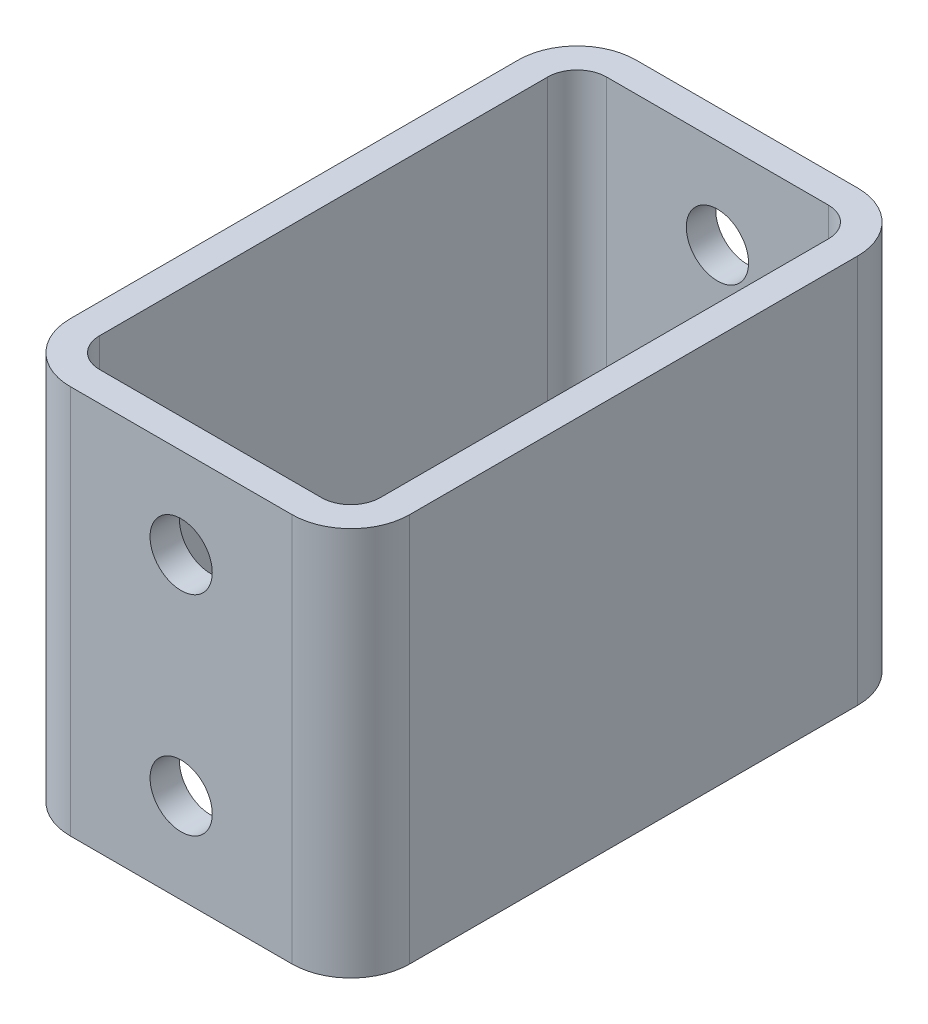
ISO-10303-21;
HEADER;
FILE_DESCRIPTION(('STEP AP214'),'2;1');
FILE_NAME('part.step','',(''),(''),'','','');
FILE_SCHEMA(('AUTOMOTIVE_DESIGN { 1 0 10303 214 1 1 1 1 }'));
ENDSEC;
DATA;
#1=APPLICATION_CONTEXT('core data for automotive mechanical design processes');
#2=APPLICATION_PROTOCOL_DEFINITION('international standard','automotive_design',2000,#1);
#3=PRODUCT_CONTEXT('',#1,'mechanical');
#4=PRODUCT('Part','Part','',(#3));
#5=PRODUCT_RELATED_PRODUCT_CATEGORY('part','',(#4));
#6=PRODUCT_DEFINITION_FORMATION('','',#4);
#7=PRODUCT_DEFINITION_CONTEXT('part definition',#1,'design');
#8=PRODUCT_DEFINITION('design','',#6,#7);
#9=PRODUCT_DEFINITION_SHAPE('','',#8);
#10=(LENGTH_UNIT() NAMED_UNIT(*) SI_UNIT(.MILLI.,.METRE.));
#11=(NAMED_UNIT(*) PLANE_ANGLE_UNIT() SI_UNIT($,.RADIAN.));
#12=(NAMED_UNIT(*) SI_UNIT($,.STERADIAN.) SOLID_ANGLE_UNIT());
#13=UNCERTAINTY_MEASURE_WITH_UNIT(LENGTH_MEASURE(1.E-05),#10,'distance_accuracy_value','');
#14=(GEOMETRIC_REPRESENTATION_CONTEXT(3) GLOBAL_UNCERTAINTY_ASSIGNED_CONTEXT((#13)) GLOBAL_UNIT_ASSIGNED_CONTEXT((#10,
#11,#12)) REPRESENTATION_CONTEXT('',''));
#15=CARTESIAN_POINT('',(0.,0.,0.));
#16=DIRECTION('',(0.,0.,1.));
#17=DIRECTION('',(1.,0.,0.));
#18=AXIS2_PLACEMENT_3D('',#15,#16,#17);
#19=CARTESIAN_POINT('',(9.8,34.4,-19.8));
#20=DIRECTION('',(0.,-1.,0.));
#21=DIRECTION('',(0.,0.,-1.));
#22=AXIS2_PLACEMENT_3D('',#19,#20,#21);
#23=CYLINDRICAL_SURFACE('',#22,5.2);
#24=CARTESIAN_POINT('',(9.8,0.,-19.8));
#25=DIRECTION('',(0.,1.,0.));
#26=DIRECTION('',(0.,0.,1.));
#27=AXIS2_PLACEMENT_3D('',#24,#25,#26);
#28=CIRCLE('',#27,5.2);
#29=CARTESIAN_POINT('',(15.,0.,-19.8));
#30=VERTEX_POINT('',#29);
#31=CARTESIAN_POINT('',(9.8,0.,-25.));
#32=VERTEX_POINT('',#31);
#33=EDGE_CURVE('E242',#30,#32,#28,.T.);
#34=ORIENTED_EDGE('',*,*,#33,.T.);
#35=DIRECTION('',(0.,-1.,0.));
#36=VECTOR('',#35,1.);
#37=CARTESIAN_POINT('',(9.8,34.4,-25.));
#38=LINE('',#37,#36);
#39=CARTESIAN_POINT('',(9.8,34.4,-25.));
#40=VERTEX_POINT('',#39);
#41=EDGE_CURVE('E12',#40,#32,#38,.T.);
#42=ORIENTED_EDGE('',*,*,#41,.F.);
#43=CARTESIAN_POINT('',(9.8,34.4,-19.8));
#44=DIRECTION('',(0.,1.,0.));
#45=DIRECTION('',(0.,0.,1.));
#46=AXIS2_PLACEMENT_3D('',#43,#44,#45);
#47=CIRCLE('',#46,5.2);
#48=CARTESIAN_POINT('',(15.,34.4,-19.8));
#49=VERTEX_POINT('',#48);
#50=EDGE_CURVE('E321',#49,#40,#47,.T.);
#51=ORIENTED_EDGE('',*,*,#50,.F.);
#52=DIRECTION('',(0.,-1.,0.));
#53=VECTOR('',#52,1.);
#54=CARTESIAN_POINT('',(15.,34.4,-19.8));
#55=LINE('',#54,#53);
#56=EDGE_CURVE('E257',#49,#30,#55,.T.);
#57=ORIENTED_EDGE('',*,*,#56,.T.);
#58=EDGE_LOOP('',(#34,#42,#51,#57));
#59=FACE_BOUND('',#58,.T.);
#60=ADVANCED_FACE('F68',(#59),#23,.T.);
#61=CARTESIAN_POINT('',(9.8,34.4,-25.));
#62=DIRECTION('',(0.,0.,1.));
#63=DIRECTION('',(1.,0.,0.));
#64=AXIS2_PLACEMENT_3D('',#61,#62,#63);
#65=PLANE('',#64);
#66=CARTESIAN_POINT('',(0.,26.435,-25.));
#67=DIRECTION('',(0.,0.,1.));
#68=DIRECTION('',(1.,0.,0.));
#69=AXIS2_PLACEMENT_3D('',#66,#67,#68);
#70=CIRCLE('',#69,2.74999999999999);
#71=CARTESIAN_POINT('',(2.74999999999999,26.435,-25.));
#72=VERTEX_POINT('',#71);
#73=EDGE_CURVE('E441',#72,#72,#70,.T.);
#74=ORIENTED_EDGE('',*,*,#73,.T.);
#75=EDGE_LOOP('',(#74));
#76=FACE_BOUND('',#75,.T.);
#77=CARTESIAN_POINT('',(0.,7.965,-25.));
#78=DIRECTION('',(0.,0.,1.));
#79=DIRECTION('',(1.,0.,0.));
#80=AXIS2_PLACEMENT_3D('',#77,#78,#79);
#81=CIRCLE('',#80,2.74999999999999);
#82=CARTESIAN_POINT('',(2.75,7.965,-25.));
#83=VERTEX_POINT('',#82);
#84=EDGE_CURVE('E284',#83,#83,#81,.T.);
#85=ORIENTED_EDGE('',*,*,#84,.T.);
#86=EDGE_LOOP('',(#85));
#87=FACE_BOUND('',#86,.T.);
#88=DIRECTION('',(-1.,0.,0.));
#89=VECTOR('',#88,1.);
#90=CARTESIAN_POINT('',(9.8,0.,-25.));
#91=LINE('',#90,#89);
#92=CARTESIAN_POINT('',(-9.8,0.,-25.));
#93=VERTEX_POINT('',#92);
#94=EDGE_CURVE('E245',#32,#93,#91,.T.);
#95=ORIENTED_EDGE('',*,*,#94,.T.);
#96=DIRECTION('',(0.,-1.,0.));
#97=VECTOR('',#96,1.);
#98=CARTESIAN_POINT('',(-9.8,34.4,-25.));
#99=LINE('',#98,#97);
#100=CARTESIAN_POINT('',(-9.8,34.4,-25.));
#101=VERTEX_POINT('',#100);
#102=EDGE_CURVE('E78',#101,#93,#99,.T.);
#103=ORIENTED_EDGE('',*,*,#102,.F.);
#104=DIRECTION('',(-1.,0.,0.));
#105=VECTOR('',#104,1.);
#106=CARTESIAN_POINT('',(9.8,34.4,-25.));
#107=LINE('',#106,#105);
#108=EDGE_CURVE('E323',#40,#101,#107,.T.);
#109=ORIENTED_EDGE('',*,*,#108,.F.);
#110=ORIENTED_EDGE('',*,*,#41,.T.);
#111=EDGE_LOOP('',(#95,#103,#109,#110));
#112=FACE_BOUND('',#111,.T.);
#113=ADVANCED_FACE('F361',(#76,#87,#112),#65,.F.);
#114=CARTESIAN_POINT('',(-9.8,34.4,-19.8));
#115=DIRECTION('',(0.,-1.,0.));
#116=DIRECTION('',(0.,0.,-1.));
#117=AXIS2_PLACEMENT_3D('',#114,#115,#116);
#118=CYLINDRICAL_SURFACE('',#117,5.2);
#119=CARTESIAN_POINT('',(-9.8,0.,-19.8));
#120=DIRECTION('',(0.,1.,0.));
#121=DIRECTION('',(0.,0.,1.));
#122=AXIS2_PLACEMENT_3D('',#119,#120,#121);
#123=CIRCLE('',#122,5.2);
#124=CARTESIAN_POINT('',(-15.,0.,-19.8));
#125=VERTEX_POINT('',#124);
#126=EDGE_CURVE('E247',#93,#125,#123,.T.);
#127=ORIENTED_EDGE('',*,*,#126,.T.);
#128=DIRECTION('',(0.,-1.,0.));
#129=VECTOR('',#128,1.);
#130=CARTESIAN_POINT('',(-15.,34.4,-19.8));
#131=LINE('',#130,#129);
#132=CARTESIAN_POINT('',(-15.,34.4,-19.8));
#133=VERTEX_POINT('',#132);
#134=EDGE_CURVE('E264',#133,#125,#131,.T.);
#135=ORIENTED_EDGE('',*,*,#134,.F.);
#136=CARTESIAN_POINT('',(-9.8,34.4,-19.8));
#137=DIRECTION('',(0.,1.,0.));
#138=DIRECTION('',(0.,0.,1.));
#139=AXIS2_PLACEMENT_3D('',#136,#137,#138);
#140=CIRCLE('',#139,5.2);
#141=EDGE_CURVE('E325',#101,#133,#140,.T.);
#142=ORIENTED_EDGE('',*,*,#141,.F.);
#143=ORIENTED_EDGE('',*,*,#102,.T.);
#144=EDGE_LOOP('',(#127,#135,#142,#143));
#145=FACE_BOUND('',#144,.T.);
#146=ADVANCED_FACE('F366',(#145),#118,.T.);
#147=CARTESIAN_POINT('',(-15.,34.4,19.8));
#148=DIRECTION('',(1.,0.,0.));
#149=DIRECTION('',(0.,0.,-1.));
#150=AXIS2_PLACEMENT_3D('',#147,#148,#149);
#151=PLANE('',#150);
#152=DIRECTION('',(0.,0.,1.));
#153=VECTOR('',#152,1.);
#154=CARTESIAN_POINT('',(-15.,0.,19.8));
#155=LINE('',#154,#153);
#156=CARTESIAN_POINT('',(-15.,0.,19.8));
#157=VERTEX_POINT('',#156);
#158=EDGE_CURVE('E249',#125,#157,#155,.T.);
#159=ORIENTED_EDGE('',*,*,#158,.T.);
#160=DIRECTION('',(0.,-1.,0.));
#161=VECTOR('',#160,1.);
#162=CARTESIAN_POINT('',(-15.,34.4,19.8));
#163=LINE('',#162,#161);
#164=CARTESIAN_POINT('',(-15.,34.4,19.8));
#165=VERTEX_POINT('',#164);
#166=EDGE_CURVE('E261',#165,#157,#163,.T.);
#167=ORIENTED_EDGE('',*,*,#166,.F.);
#168=DIRECTION('',(0.,0.,1.));
#169=VECTOR('',#168,1.);
#170=CARTESIAN_POINT('',(-15.,34.4,19.8));
#171=LINE('',#170,#169);
#172=EDGE_CURVE('E327',#133,#165,#171,.T.);
#173=ORIENTED_EDGE('',*,*,#172,.F.);
#174=ORIENTED_EDGE('',*,*,#134,.T.);
#175=EDGE_LOOP('',(#159,#167,#173,#174));
#176=FACE_BOUND('',#175,.T.);
#177=ADVANCED_FACE('F333',(#176),#151,.F.);
#178=CARTESIAN_POINT('',(-9.8,34.4,19.8));
#179=DIRECTION('',(0.,-1.,0.));
#180=DIRECTION('',(0.,0.,-1.));
#181=AXIS2_PLACEMENT_3D('',#178,#179,#180);
#182=CYLINDRICAL_SURFACE('',#181,5.2);
#183=CARTESIAN_POINT('',(-9.8,0.,19.8));
#184=DIRECTION('',(0.,1.,0.));
#185=DIRECTION('',(0.,0.,1.));
#186=AXIS2_PLACEMENT_3D('',#183,#184,#185);
#187=CIRCLE('',#186,5.2);
#188=CARTESIAN_POINT('',(-9.8,0.,25.));
#189=VERTEX_POINT('',#188);
#190=EDGE_CURVE('E251',#157,#189,#187,.T.);
#191=ORIENTED_EDGE('',*,*,#190,.T.);
#192=DIRECTION('',(0.,-1.,0.));
#193=VECTOR('',#192,1.);
#194=CARTESIAN_POINT('',(-9.8,34.4,25.));
#195=LINE('',#194,#193);
#196=CARTESIAN_POINT('',(-9.8,34.4,25.));
#197=VERTEX_POINT('',#196);
#198=EDGE_CURVE('E208',#197,#189,#195,.T.);
#199=ORIENTED_EDGE('',*,*,#198,.F.);
#200=CARTESIAN_POINT('',(-9.8,34.4,19.8));
#201=DIRECTION('',(0.,1.,0.));
#202=DIRECTION('',(0.,0.,1.));
#203=AXIS2_PLACEMENT_3D('',#200,#201,#202);
#204=CIRCLE('',#203,5.2);
#205=EDGE_CURVE('E199',#165,#197,#204,.T.);
#206=ORIENTED_EDGE('',*,*,#205,.F.);
#207=ORIENTED_EDGE('',*,*,#166,.T.);
#208=EDGE_LOOP('',(#191,#199,#206,#207));
#209=FACE_BOUND('',#208,.T.);
#210=ADVANCED_FACE('F337',(#209),#182,.T.);
#211=CARTESIAN_POINT('',(-9.8,34.4,25.));
#212=DIRECTION('',(0.,0.,-1.));
#213=DIRECTION('',(-1.,0.,0.));
#214=AXIS2_PLACEMENT_3D('',#211,#212,#213);
#215=PLANE('',#214);
#216=CARTESIAN_POINT('',(0.,26.435,25.));
#217=DIRECTION('',(0.,0.,1.));
#218=DIRECTION('',(1.,0.,0.));
#219=AXIS2_PLACEMENT_3D('',#216,#217,#218);
#220=CIRCLE('',#219,2.74999999999999);
#221=CARTESIAN_POINT('',(2.74999999999999,26.435,25.));
#222=VERTEX_POINT('',#221);
#223=EDGE_CURVE('E439',#222,#222,#220,.T.);
#224=ORIENTED_EDGE('',*,*,#223,.F.);
#225=EDGE_LOOP('',(#224));
#226=FACE_BOUND('',#225,.T.);
#227=CARTESIAN_POINT('',(0.,7.965,25.));
#228=DIRECTION('',(0.,0.,1.));
#229=DIRECTION('',(1.,0.,0.));
#230=AXIS2_PLACEMENT_3D('',#227,#228,#229);
#231=CIRCLE('',#230,2.74999999999999);
#232=CARTESIAN_POINT('',(2.74999999999999,7.965,25.));
#233=VERTEX_POINT('',#232);
#234=EDGE_CURVE('E290',#233,#233,#231,.T.);
#235=ORIENTED_EDGE('',*,*,#234,.F.);
#236=EDGE_LOOP('',(#235));
#237=FACE_BOUND('',#236,.T.);
#238=DIRECTION('',(1.,0.,0.));
#239=VECTOR('',#238,1.);
#240=CARTESIAN_POINT('',(-9.8,0.,25.));
#241=LINE('',#240,#239);
#242=CARTESIAN_POINT('',(9.8,0.,25.));
#243=VERTEX_POINT('',#242);
#244=EDGE_CURVE('E207',#189,#243,#241,.T.);
#245=ORIENTED_EDGE('',*,*,#244,.T.);
#246=DIRECTION('',(0.,-1.,0.));
#247=VECTOR('',#246,1.);
#248=CARTESIAN_POINT('',(9.8,34.4,25.));
#249=LINE('',#248,#247);
#250=CARTESIAN_POINT('',(9.8,34.4,25.));
#251=VERTEX_POINT('',#250);
#252=EDGE_CURVE('E204',#251,#243,#249,.T.);
#253=ORIENTED_EDGE('',*,*,#252,.F.);
#254=DIRECTION('',(1.,0.,0.));
#255=VECTOR('',#254,1.);
#256=CARTESIAN_POINT('',(-9.8,34.4,25.));
#257=LINE('',#256,#255);
#258=EDGE_CURVE('E193',#197,#251,#257,.T.);
#259=ORIENTED_EDGE('',*,*,#258,.F.);
#260=ORIENTED_EDGE('',*,*,#198,.T.);
#261=EDGE_LOOP('',(#245,#253,#259,#260));
#262=FACE_BOUND('',#261,.T.);
#263=ADVANCED_FACE('F205',(#226,#237,#262),#215,.F.);
#264=CARTESIAN_POINT('',(9.8,34.4,19.8));
#265=DIRECTION('',(0.,-1.,0.));
#266=DIRECTION('',(0.,0.,-1.));
#267=AXIS2_PLACEMENT_3D('',#264,#265,#266);
#268=CYLINDRICAL_SURFACE('',#267,5.2);
#269=CARTESIAN_POINT('',(9.8,0.,19.8));
#270=DIRECTION('',(0.,1.,0.));
#271=DIRECTION('',(0.,0.,1.));
#272=AXIS2_PLACEMENT_3D('',#269,#270,#271);
#273=CIRCLE('',#272,5.2);
#274=CARTESIAN_POINT('',(15.,0.,19.8));
#275=VERTEX_POINT('',#274);
#276=EDGE_CURVE('E140',#243,#275,#273,.T.);
#277=ORIENTED_EDGE('',*,*,#276,.T.);
#278=DIRECTION('',(0.,-1.,0.));
#279=VECTOR('',#278,1.);
#280=CARTESIAN_POINT('',(15.,34.4,19.8));
#281=LINE('',#280,#279);
#282=CARTESIAN_POINT('',(15.,34.4,19.8));
#283=VERTEX_POINT('',#282);
#284=EDGE_CURVE('E209',#283,#275,#281,.T.);
#285=ORIENTED_EDGE('',*,*,#284,.F.);
#286=CARTESIAN_POINT('',(9.8,34.4,19.8));
#287=DIRECTION('',(0.,1.,0.));
#288=DIRECTION('',(0.,0.,1.));
#289=AXIS2_PLACEMENT_3D('',#286,#287,#288);
#290=CIRCLE('',#289,5.2);
#291=EDGE_CURVE('E197',#251,#283,#290,.T.);
#292=ORIENTED_EDGE('',*,*,#291,.F.);
#293=ORIENTED_EDGE('',*,*,#252,.T.);
#294=EDGE_LOOP('',(#277,#285,#292,#293));
#295=FACE_BOUND('',#294,.T.);
#296=ADVANCED_FACE('F211',(#295),#268,.T.);
#297=CARTESIAN_POINT('',(-9.8,34.4,-19.8));
#298=DIRECTION('',(0.,-1.,0.));
#299=DIRECTION('',(0.,0.,-1.));
#300=AXIS2_PLACEMENT_3D('',#297,#298,#299);
#301=CYLINDRICAL_SURFACE('',#300,2.6);
#302=CARTESIAN_POINT('',(-9.8,0.,-19.8));
#303=DIRECTION('',(0.,1.,0.));
#304=DIRECTION('',(0.,0.,1.));
#305=AXIS2_PLACEMENT_3D('',#302,#303,#304);
#306=CIRCLE('',#305,2.6);
#307=CARTESIAN_POINT('',(-9.8,0.,-22.4));
#308=VERTEX_POINT('',#307);
#309=CARTESIAN_POINT('',(-12.4,0.,-19.8));
#310=VERTEX_POINT('',#309);
#311=EDGE_CURVE('E217',#308,#310,#306,.T.);
#312=ORIENTED_EDGE('',*,*,#311,.F.);
#313=DIRECTION('',(0.,-1.,0.));
#314=VECTOR('',#313,1.);
#315=CARTESIAN_POINT('',(-9.8,34.4,-22.4));
#316=LINE('',#315,#314);
#317=CARTESIAN_POINT('',(-9.8,34.4,-22.4));
#318=VERTEX_POINT('',#317);
#319=EDGE_CURVE('E154',#318,#308,#316,.T.);
#320=ORIENTED_EDGE('',*,*,#319,.F.);
#321=CARTESIAN_POINT('',(-9.8,34.4,-19.8));
#322=DIRECTION('',(0.,1.,0.));
#323=DIRECTION('',(0.,0.,1.));
#324=AXIS2_PLACEMENT_3D('',#321,#322,#323);
#325=CIRCLE('',#324,2.6);
#326=CARTESIAN_POINT('',(-12.4,34.4,-19.8));
#327=VERTEX_POINT('',#326);
#328=EDGE_CURVE('E256',#318,#327,#325,.T.);
#329=ORIENTED_EDGE('',*,*,#328,.T.);
#330=DIRECTION('',(0.,-1.,0.));
#331=VECTOR('',#330,1.);
#332=CARTESIAN_POINT('',(-12.4,34.4,-19.8));
#333=LINE('',#332,#331);
#334=EDGE_CURVE('E213',#327,#310,#333,.T.);
#335=ORIENTED_EDGE('',*,*,#334,.T.);
#336=EDGE_LOOP('',(#312,#320,#329,#335));
#337=FACE_BOUND('',#336,.T.);
#338=ADVANCED_FACE('F70',(#337),#301,.F.);
#339=CARTESIAN_POINT('',(9.8,34.4,-22.4));
#340=DIRECTION('',(0.,0.,1.));
#341=DIRECTION('',(1.,0.,0.));
#342=AXIS2_PLACEMENT_3D('',#339,#340,#341);
#343=PLANE('',#342);
#344=CARTESIAN_POINT('',(0.,26.435,-22.4));
#345=DIRECTION('',(0.,0.,1.));
#346=DIRECTION('',(1.,0.,0.));
#347=AXIS2_PLACEMENT_3D('',#344,#345,#346);
#348=CIRCLE('',#347,2.74999999999999);
#349=CARTESIAN_POINT('',(2.74999999999999,26.435,-22.4));
#350=VERTEX_POINT('',#349);
#351=EDGE_CURVE('E295',#350,#350,#348,.T.);
#352=ORIENTED_EDGE('',*,*,#351,.F.);
#353=EDGE_LOOP('',(#352));
#354=FACE_BOUND('',#353,.T.);
#355=CARTESIAN_POINT('',(0.,7.965,-22.4));
#356=DIRECTION('',(0.,0.,1.));
#357=DIRECTION('',(1.,0.,0.));
#358=AXIS2_PLACEMENT_3D('',#355,#356,#357);
#359=CIRCLE('',#358,2.74999999999999);
#360=CARTESIAN_POINT('',(2.74999999999999,7.965,-22.4));
#361=VERTEX_POINT('',#360);
#362=EDGE_CURVE('E221',#361,#361,#359,.T.);
#363=ORIENTED_EDGE('',*,*,#362,.F.);
#364=EDGE_LOOP('',(#363));
#365=FACE_BOUND('',#364,.T.);
#366=DIRECTION('',(-1.,0.,0.));
#367=VECTOR('',#366,1.);
#368=CARTESIAN_POINT('',(9.8,0.,-22.4));
#369=LINE('',#368,#367);
#370=CARTESIAN_POINT('',(9.8,0.,-22.4));
#371=VERTEX_POINT('',#370);
#372=EDGE_CURVE('E220',#371,#308,#369,.T.);
#373=ORIENTED_EDGE('',*,*,#372,.F.);
#374=DIRECTION('',(0.,-1.,0.));
#375=VECTOR('',#374,1.);
#376=CARTESIAN_POINT('',(9.8,34.4,-22.4));
#377=LINE('',#376,#375);
#378=CARTESIAN_POINT('',(9.8,34.4,-22.4));
#379=VERTEX_POINT('',#378);
#380=EDGE_CURVE('E280',#379,#371,#377,.T.);
#381=ORIENTED_EDGE('',*,*,#380,.F.);
#382=DIRECTION('',(-1.,0.,0.));
#383=VECTOR('',#382,1.);
#384=CARTESIAN_POINT('',(9.8,34.4,-22.4));
#385=LINE('',#384,#383);
#386=EDGE_CURVE('E300',#379,#318,#385,.T.);
#387=ORIENTED_EDGE('',*,*,#386,.T.);
#388=ORIENTED_EDGE('',*,*,#319,.T.);
#389=EDGE_LOOP('',(#373,#381,#387,#388));
#390=FACE_BOUND('',#389,.T.);
#391=ADVANCED_FACE('F388',(#354,#365,#390),#343,.T.);
#392=CARTESIAN_POINT('',(9.8,34.4,-19.8));
#393=DIRECTION('',(0.,-1.,0.));
#394=DIRECTION('',(0.,0.,-1.));
#395=AXIS2_PLACEMENT_3D('',#392,#393,#394);
#396=CYLINDRICAL_SURFACE('',#395,2.6);
#397=CARTESIAN_POINT('',(9.8,0.,-19.8));
#398=DIRECTION('',(0.,1.,0.));
#399=DIRECTION('',(0.,0.,1.));
#400=AXIS2_PLACEMENT_3D('',#397,#398,#399);
#401=CIRCLE('',#400,2.6);
#402=CARTESIAN_POINT('',(12.4,0.,-19.8));
#403=VERTEX_POINT('',#402);
#404=EDGE_CURVE('E224',#403,#371,#401,.T.);
#405=ORIENTED_EDGE('',*,*,#404,.F.);
#406=DIRECTION('',(0.,-1.,0.));
#407=VECTOR('',#406,1.);
#408=CARTESIAN_POINT('',(12.4,34.4,-19.8));
#409=LINE('',#408,#407);
#410=CARTESIAN_POINT('',(12.4,34.4,-19.8));
#411=VERTEX_POINT('',#410);
#412=EDGE_CURVE('E278',#411,#403,#409,.T.);
#413=ORIENTED_EDGE('',*,*,#412,.F.);
#414=CARTESIAN_POINT('',(9.8,34.4,-19.8));
#415=DIRECTION('',(0.,1.,0.));
#416=DIRECTION('',(0.,0.,1.));
#417=AXIS2_PLACEMENT_3D('',#414,#415,#416);
#418=CIRCLE('',#417,2.6);
#419=EDGE_CURVE('E303',#411,#379,#418,.T.);
#420=ORIENTED_EDGE('',*,*,#419,.T.);
#421=ORIENTED_EDGE('',*,*,#380,.T.);
#422=EDGE_LOOP('',(#405,#413,#420,#421));
#423=FACE_BOUND('',#422,.T.);
#424=ADVANCED_FACE('F385',(#423),#396,.F.);
#425=CARTESIAN_POINT('',(12.4,34.4,-19.8));
#426=DIRECTION('',(-1.,0.,0.));
#427=DIRECTION('',(0.,0.,1.));
#428=AXIS2_PLACEMENT_3D('',#425,#426,#427);
#429=PLANE('',#428);
#430=DIRECTION('',(0.,0.,-1.));
#431=VECTOR('',#430,1.);
#432=CARTESIAN_POINT('',(12.4,0.,-19.8));
#433=LINE('',#432,#431);
#434=CARTESIAN_POINT('',(12.4,0.,19.8));
#435=VERTEX_POINT('',#434);
#436=EDGE_CURVE('E227',#435,#403,#433,.T.);
#437=ORIENTED_EDGE('',*,*,#436,.F.);
#438=DIRECTION('',(0.,-1.,0.));
#439=VECTOR('',#438,1.);
#440=CARTESIAN_POINT('',(12.4,34.4,19.8));
#441=LINE('',#440,#439);
#442=CARTESIAN_POINT('',(12.4,34.4,19.8));
#443=VERTEX_POINT('',#442);
#444=EDGE_CURVE('E276',#443,#435,#441,.T.);
#445=ORIENTED_EDGE('',*,*,#444,.F.);
#446=DIRECTION('',(0.,0.,-1.));
#447=VECTOR('',#446,1.);
#448=CARTESIAN_POINT('',(12.4,34.4,-19.8));
#449=LINE('',#448,#447);
#450=EDGE_CURVE('E306',#443,#411,#449,.T.);
#451=ORIENTED_EDGE('',*,*,#450,.T.);
#452=ORIENTED_EDGE('',*,*,#412,.T.);
#453=EDGE_LOOP('',(#437,#445,#451,#452));
#454=FACE_BOUND('',#453,.T.);
#455=ADVANCED_FACE('F381',(#454),#429,.T.);
#456=CARTESIAN_POINT('',(9.8,34.4,19.8));
#457=DIRECTION('',(0.,-1.,0.));
#458=DIRECTION('',(0.,0.,-1.));
#459=AXIS2_PLACEMENT_3D('',#456,#457,#458);
#460=CYLINDRICAL_SURFACE('',#459,2.6);
#461=CARTESIAN_POINT('',(9.8,0.,19.8));
#462=DIRECTION('',(0.,1.,0.));
#463=DIRECTION('',(0.,0.,1.));
#464=AXIS2_PLACEMENT_3D('',#461,#462,#463);
#465=CIRCLE('',#464,2.6);
#466=CARTESIAN_POINT('',(9.8,0.,22.4));
#467=VERTEX_POINT('',#466);
#468=EDGE_CURVE('E230',#467,#435,#465,.T.);
#469=ORIENTED_EDGE('',*,*,#468,.F.);
#470=DIRECTION('',(0.,-1.,0.));
#471=VECTOR('',#470,1.);
#472=CARTESIAN_POINT('',(9.8,34.4,22.4));
#473=LINE('',#472,#471);
#474=CARTESIAN_POINT('',(9.8,34.4,22.4));
#475=VERTEX_POINT('',#474);
#476=EDGE_CURVE('E274',#475,#467,#473,.T.);
#477=ORIENTED_EDGE('',*,*,#476,.F.);
#478=CARTESIAN_POINT('',(9.8,34.4,19.8));
#479=DIRECTION('',(0.,1.,0.));
#480=DIRECTION('',(0.,0.,1.));
#481=AXIS2_PLACEMENT_3D('',#478,#479,#480);
#482=CIRCLE('',#481,2.6);
#483=EDGE_CURVE('E309',#475,#443,#482,.T.);
#484=ORIENTED_EDGE('',*,*,#483,.T.);
#485=ORIENTED_EDGE('',*,*,#444,.T.);
#486=EDGE_LOOP('',(#469,#477,#484,#485));
#487=FACE_BOUND('',#486,.T.);
#488=ADVANCED_FACE('F377',(#487),#460,.F.);
#489=CARTESIAN_POINT('',(-9.8,34.4,22.4));
#490=DIRECTION('',(0.,0.,-1.));
#491=DIRECTION('',(-1.,0.,0.));
#492=AXIS2_PLACEMENT_3D('',#489,#490,#491);
#493=PLANE('',#492);
#494=CARTESIAN_POINT('',(0.,26.435,22.4));
#495=DIRECTION('',(0.,0.,-1.));
#496=DIRECTION('',(-1.,0.,0.));
#497=AXIS2_PLACEMENT_3D('',#494,#495,#496);
#498=CIRCLE('',#497,2.74999999999999);
#499=CARTESIAN_POINT('',(-2.74999999999999,26.435,22.4));
#500=VERTEX_POINT('',#499);
#501=EDGE_CURVE('E72',#500,#500,#498,.T.);
#502=ORIENTED_EDGE('',*,*,#501,.F.);
#503=EDGE_LOOP('',(#502));
#504=FACE_BOUND('',#503,.T.);
#505=CARTESIAN_POINT('',(0.,7.965,22.4));
#506=DIRECTION('',(0.,0.,-1.));
#507=DIRECTION('',(-1.,0.,0.));
#508=AXIS2_PLACEMENT_3D('',#505,#506,#507);
#509=CIRCLE('',#508,2.74999999999999);
#510=CARTESIAN_POINT('',(-2.74999999999999,7.965,22.4));
#511=VERTEX_POINT('',#510);
#512=EDGE_CURVE('E282',#511,#511,#509,.T.);
#513=ORIENTED_EDGE('',*,*,#512,.F.);
#514=EDGE_LOOP('',(#513));
#515=FACE_BOUND('',#514,.T.);
#516=DIRECTION('',(1.,0.,0.));
#517=VECTOR('',#516,1.);
#518=CARTESIAN_POINT('',(-9.8,0.,22.4));
#519=LINE('',#518,#517);
#520=CARTESIAN_POINT('',(-9.8,0.,22.4));
#521=VERTEX_POINT('',#520);
#522=EDGE_CURVE('E233',#521,#467,#519,.T.);
#523=ORIENTED_EDGE('',*,*,#522,.F.);
#524=DIRECTION('',(0.,-1.,0.));
#525=VECTOR('',#524,1.);
#526=CARTESIAN_POINT('',(-9.8,34.4,22.4));
#527=LINE('',#526,#525);
#528=CARTESIAN_POINT('',(-9.8,34.4,22.4));
#529=VERTEX_POINT('',#528);
#530=EDGE_CURVE('E272',#529,#521,#527,.T.);
#531=ORIENTED_EDGE('',*,*,#530,.F.);
#532=DIRECTION('',(1.,0.,0.));
#533=VECTOR('',#532,1.);
#534=CARTESIAN_POINT('',(-9.8,34.4,22.4));
#535=LINE('',#534,#533);
#536=EDGE_CURVE('E312',#529,#475,#535,.T.);
#537=ORIENTED_EDGE('',*,*,#536,.T.);
#538=ORIENTED_EDGE('',*,*,#476,.T.);
#539=EDGE_LOOP('',(#523,#531,#537,#538));
#540=FACE_BOUND('',#539,.T.);
#541=ADVANCED_FACE('F373',(#504,#515,#540),#493,.T.);
#542=CARTESIAN_POINT('',(-9.8,34.4,19.8));
#543=DIRECTION('',(0.,-1.,0.));
#544=DIRECTION('',(0.,0.,-1.));
#545=AXIS2_PLACEMENT_3D('',#542,#543,#544);
#546=CYLINDRICAL_SURFACE('',#545,2.6);
#547=CARTESIAN_POINT('',(-9.8,0.,19.8));
#548=DIRECTION('',(0.,1.,0.));
#549=DIRECTION('',(0.,0.,1.));
#550=AXIS2_PLACEMENT_3D('',#547,#548,#549);
#551=CIRCLE('',#550,2.6);
#552=CARTESIAN_POINT('',(-12.4,0.,19.8));
#553=VERTEX_POINT('',#552);
#554=EDGE_CURVE('E236',#553,#521,#551,.T.);
#555=ORIENTED_EDGE('',*,*,#554,.F.);
#556=DIRECTION('',(0.,-1.,0.));
#557=VECTOR('',#556,1.);
#558=CARTESIAN_POINT('',(-12.4,34.4,19.8));
#559=LINE('',#558,#557);
#560=CARTESIAN_POINT('',(-12.4,34.4,19.8));
#561=VERTEX_POINT('',#560);
#562=EDGE_CURVE('E270',#561,#553,#559,.T.);
#563=ORIENTED_EDGE('',*,*,#562,.F.);
#564=CARTESIAN_POINT('',(-9.8,34.4,19.8));
#565=DIRECTION('',(0.,1.,0.));
#566=DIRECTION('',(0.,0.,1.));
#567=AXIS2_PLACEMENT_3D('',#564,#565,#566);
#568=CIRCLE('',#567,2.6);
#569=EDGE_CURVE('E315',#561,#529,#568,.T.);
#570=ORIENTED_EDGE('',*,*,#569,.T.);
#571=ORIENTED_EDGE('',*,*,#530,.T.);
#572=EDGE_LOOP('',(#555,#563,#570,#571));
#573=FACE_BOUND('',#572,.T.);
#574=ADVANCED_FACE('F355',(#573),#546,.F.);
#575=CARTESIAN_POINT('',(-12.4,34.4,19.8));
#576=DIRECTION('',(1.,0.,0.));
#577=DIRECTION('',(0.,0.,-1.));
#578=AXIS2_PLACEMENT_3D('',#575,#576,#577);
#579=PLANE('',#578);
#580=DIRECTION('',(0.,0.,1.));
#581=VECTOR('',#580,1.);
#582=CARTESIAN_POINT('',(-12.4,0.,19.8));
#583=LINE('',#582,#581);
#584=EDGE_CURVE('E239',#310,#553,#583,.T.);
#585=ORIENTED_EDGE('',*,*,#584,.F.);
#586=ORIENTED_EDGE('',*,*,#334,.F.);
#587=DIRECTION('',(0.,0.,1.));
#588=VECTOR('',#587,1.);
#589=CARTESIAN_POINT('',(-12.4,34.4,19.8));
#590=LINE('',#589,#588);
#591=EDGE_CURVE('E318',#327,#561,#590,.T.);
#592=ORIENTED_EDGE('',*,*,#591,.T.);
#593=ORIENTED_EDGE('',*,*,#562,.T.);
#594=EDGE_LOOP('',(#585,#586,#592,#593));
#595=FACE_BOUND('',#594,.T.);
#596=ADVANCED_FACE('F347',(#595),#579,.T.);
#597=CARTESIAN_POINT('',(15.,34.4,-19.8));
#598=DIRECTION('',(-1.,0.,0.));
#599=DIRECTION('',(0.,0.,1.));
#600=AXIS2_PLACEMENT_3D('',#597,#598,#599);
#601=PLANE('',#600);
#602=DIRECTION('',(0.,0.,-1.));
#603=VECTOR('',#602,1.);
#604=CARTESIAN_POINT('',(15.,0.,-19.8));
#605=LINE('',#604,#603);
#606=EDGE_CURVE('E146',#275,#30,#605,.T.);
#607=ORIENTED_EDGE('',*,*,#606,.T.);
#608=ORIENTED_EDGE('',*,*,#56,.F.);
#609=DIRECTION('',(0.,0.,-1.));
#610=VECTOR('',#609,1.);
#611=CARTESIAN_POINT('',(15.,34.4,-19.8));
#612=LINE('',#611,#610);
#613=EDGE_CURVE('E87',#283,#49,#612,.T.);
#614=ORIENTED_EDGE('',*,*,#613,.F.);
#615=ORIENTED_EDGE('',*,*,#284,.T.);
#616=EDGE_LOOP('',(#607,#608,#614,#615));
#617=FACE_BOUND('',#616,.T.);
#618=ADVANCED_FACE('F345',(#617),#601,.F.);
#619=CARTESIAN_POINT('',(9.8,34.4,-19.8));
#620=DIRECTION('',(0.,1.,0.));
#621=DIRECTION('',(0.,0.,1.));
#622=AXIS2_PLACEMENT_3D('',#619,#620,#621);
#623=PLANE('',#622);
#624=ORIENTED_EDGE('',*,*,#328,.F.);
#625=ORIENTED_EDGE('',*,*,#386,.F.);
#626=ORIENTED_EDGE('',*,*,#419,.F.);
#627=ORIENTED_EDGE('',*,*,#450,.F.);
#628=ORIENTED_EDGE('',*,*,#483,.F.);
#629=ORIENTED_EDGE('',*,*,#536,.F.);
#630=ORIENTED_EDGE('',*,*,#569,.F.);
#631=ORIENTED_EDGE('',*,*,#591,.F.);
#632=EDGE_LOOP('',(#624,#625,#626,#627,#628,#629,#630,#631));
#633=FACE_BOUND('',#632,.T.);
#634=ORIENTED_EDGE('',*,*,#50,.T.);
#635=ORIENTED_EDGE('',*,*,#108,.T.);
#636=ORIENTED_EDGE('',*,*,#141,.T.);
#637=ORIENTED_EDGE('',*,*,#172,.T.);
#638=ORIENTED_EDGE('',*,*,#205,.T.);
#639=ORIENTED_EDGE('',*,*,#258,.T.);
#640=ORIENTED_EDGE('',*,*,#291,.T.);
#641=ORIENTED_EDGE('',*,*,#613,.T.);
#642=EDGE_LOOP('',(#634,#635,#636,#637,#638,#639,#640,#641));
#643=FACE_BOUND('',#642,.T.);
#644=ADVANCED_FACE('F195',(#633,#643),#623,.T.);
#645=CARTESIAN_POINT('',(9.8,0.,-19.8));
#646=DIRECTION('',(0.,1.,0.));
#647=DIRECTION('',(0.,0.,1.));
#648=AXIS2_PLACEMENT_3D('',#645,#646,#647);
#649=PLANE('',#648);
#650=ORIENTED_EDGE('',*,*,#311,.T.);
#651=ORIENTED_EDGE('',*,*,#584,.T.);
#652=ORIENTED_EDGE('',*,*,#554,.T.);
#653=ORIENTED_EDGE('',*,*,#522,.T.);
#654=ORIENTED_EDGE('',*,*,#468,.T.);
#655=ORIENTED_EDGE('',*,*,#436,.T.);
#656=ORIENTED_EDGE('',*,*,#404,.T.);
#657=ORIENTED_EDGE('',*,*,#372,.T.);
#658=EDGE_LOOP('',(#650,#651,#652,#653,#654,#655,#656,#657));
#659=FACE_BOUND('',#658,.T.);
#660=ORIENTED_EDGE('',*,*,#33,.F.);
#661=ORIENTED_EDGE('',*,*,#606,.F.);
#662=ORIENTED_EDGE('',*,*,#276,.F.);
#663=ORIENTED_EDGE('',*,*,#244,.F.);
#664=ORIENTED_EDGE('',*,*,#190,.F.);
#665=ORIENTED_EDGE('',*,*,#158,.F.);
#666=ORIENTED_EDGE('',*,*,#126,.F.);
#667=ORIENTED_EDGE('',*,*,#94,.F.);
#668=EDGE_LOOP('',(#660,#661,#662,#663,#664,#665,#666,#667));
#669=FACE_BOUND('',#668,.T.);
#670=ADVANCED_FACE('F340',(#659,#669),#649,.F.);
#671=CARTESIAN_POINT('',(0.,7.965,25.));
#672=DIRECTION('',(0.,0.,1.));
#673=DIRECTION('',(1.,0.,0.));
#674=AXIS2_PLACEMENT_3D('',#671,#672,#673);
#675=CYLINDRICAL_SURFACE('',#674,2.74999999999999);
#676=ORIENTED_EDGE('',*,*,#512,.T.);
#677=EDGE_LOOP('',(#676));
#678=FACE_BOUND('',#677,.T.);
#679=ORIENTED_EDGE('',*,*,#234,.T.);
#680=EDGE_LOOP('',(#679));
#681=FACE_BOUND('',#680,.T.);
#682=ADVANCED_FACE('F417',(#678,#681),#675,.F.);
#683=ORIENTED_EDGE('',*,*,#362,.T.);
#684=EDGE_LOOP('',(#683));
#685=FACE_BOUND('',#684,.T.);
#686=ORIENTED_EDGE('',*,*,#84,.F.);
#687=EDGE_LOOP('',(#686));
#688=FACE_BOUND('',#687,.T.);
#689=ADVANCED_FACE('F421',(#685,#688),#675,.F.);
#690=CARTESIAN_POINT('',(0.,26.435,25.));
#691=DIRECTION('',(0.,0.,1.));
#692=DIRECTION('',(1.,0.,0.));
#693=AXIS2_PLACEMENT_3D('',#690,#691,#692);
#694=CYLINDRICAL_SURFACE('',#693,2.74999999999999);
#695=ORIENTED_EDGE('',*,*,#501,.T.);
#696=EDGE_LOOP('',(#695));
#697=FACE_BOUND('',#696,.T.);
#698=ORIENTED_EDGE('',*,*,#223,.T.);
#699=EDGE_LOOP('',(#698));
#700=FACE_BOUND('',#699,.T.);
#701=ADVANCED_FACE('F424',(#697,#700),#694,.F.);
#702=ORIENTED_EDGE('',*,*,#351,.T.);
#703=EDGE_LOOP('',(#702));
#704=FACE_BOUND('',#703,.T.);
#705=ORIENTED_EDGE('',*,*,#73,.F.);
#706=EDGE_LOOP('',(#705));
#707=FACE_BOUND('',#706,.T.);
#708=ADVANCED_FACE('F426',(#704,#707),#694,.F.);
#709=CLOSED_SHELL('',(#60,#113,#146,#177,#210,#263,#296,#338,#391,#424,#455,#488,#541,#574,#596,
#618,#644,#670,#682,#689,#701,#708));
#710=MANIFOLD_SOLID_BREP('B2',#709);
#711=ADVANCED_BREP_SHAPE_REPRESENTATION('',(#18,#710),#14);
#712=SHAPE_DEFINITION_REPRESENTATION(#9,#711);
ENDSEC;
END-ISO-10303-21;
